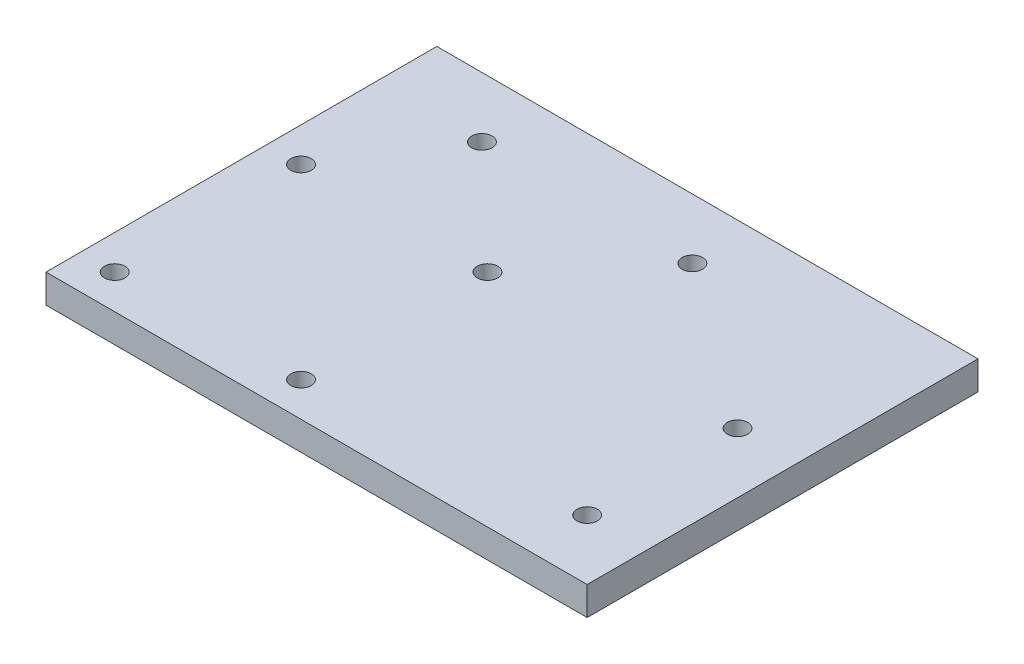
ISO-10303-21;
HEADER;
FILE_DESCRIPTION(('STEP AP214'),'2;1');
FILE_NAME('part.step','',(''),(''),'','','');
FILE_SCHEMA(('AUTOMOTIVE_DESIGN { 1 0 10303 214 1 1 1 1 }'));
ENDSEC;
DATA;
#1=APPLICATION_CONTEXT('core data for automotive mechanical design processes');
#2=APPLICATION_PROTOCOL_DEFINITION('international standard','automotive_design',2000,#1);
#3=PRODUCT_CONTEXT('',#1,'mechanical');
#4=PRODUCT('Part','Part','',(#3));
#5=PRODUCT_RELATED_PRODUCT_CATEGORY('part','',(#4));
#6=PRODUCT_DEFINITION_FORMATION('','',#4);
#7=PRODUCT_DEFINITION_CONTEXT('part definition',#1,'design');
#8=PRODUCT_DEFINITION('design','',#6,#7);
#9=PRODUCT_DEFINITION_SHAPE('','',#8);
#10=(LENGTH_UNIT() NAMED_UNIT(*) SI_UNIT(.MILLI.,.METRE.));
#11=(NAMED_UNIT(*) PLANE_ANGLE_UNIT() SI_UNIT($,.RADIAN.));
#12=(NAMED_UNIT(*) SI_UNIT($,.STERADIAN.) SOLID_ANGLE_UNIT());
#13=UNCERTAINTY_MEASURE_WITH_UNIT(LENGTH_MEASURE(1.E-05),#10,'distance_accuracy_value','');
#14=(GEOMETRIC_REPRESENTATION_CONTEXT(3) GLOBAL_UNCERTAINTY_ASSIGNED_CONTEXT((#13)) GLOBAL_UNIT_ASSIGNED_CONTEXT((#10,
#11,#12)) REPRESENTATION_CONTEXT('',''));
#15=CARTESIAN_POINT('',(0.,0.,0.));
#16=DIRECTION('',(0.,0.,1.));
#17=DIRECTION('',(1.,0.,0.));
#18=AXIS2_PLACEMENT_3D('',#15,#16,#17);
#19=CARTESIAN_POINT('',(90.,4.7625,0.));
#20=DIRECTION('',(-1.,0.,0.));
#21=DIRECTION('',(0.,0.,1.));
#22=AXIS2_PLACEMENT_3D('',#19,#20,#21);
#23=PLANE('',#22);
#24=DIRECTION('',(0.,0.,-1.));
#25=VECTOR('',#24,1.);
#26=CARTESIAN_POINT('',(90.,0.,0.));
#27=LINE('',#26,#25);
#28=CARTESIAN_POINT('',(90.,0.,0.));
#29=VERTEX_POINT('',#28);
#30=CARTESIAN_POINT('',(90.,0.,-65.));
#31=VERTEX_POINT('',#30);
#32=EDGE_CURVE('E96',#29,#31,#27,.T.);
#33=ORIENTED_EDGE('',*,*,#32,.T.);
#34=DIRECTION('',(0.,-1.,0.));
#35=VECTOR('',#34,1.);
#36=CARTESIAN_POINT('',(90.,4.7625,-65.));
#37=LINE('',#36,#35);
#38=CARTESIAN_POINT('',(90.,4.7625,-65.));
#39=VERTEX_POINT('',#38);
#40=EDGE_CURVE('E11',#39,#31,#37,.T.);
#41=ORIENTED_EDGE('',*,*,#40,.F.);
#42=DIRECTION('',(0.,0.,-1.));
#43=VECTOR('',#42,1.);
#44=CARTESIAN_POINT('',(90.,4.7625,0.));
#45=LINE('',#44,#43);
#46=CARTESIAN_POINT('',(90.,4.7625,0.));
#47=VERTEX_POINT('',#46);
#48=EDGE_CURVE('E84',#47,#39,#45,.T.);
#49=ORIENTED_EDGE('',*,*,#48,.F.);
#50=DIRECTION('',(0.,-1.,0.));
#51=VECTOR('',#50,1.);
#52=CARTESIAN_POINT('',(90.,4.7625,0.));
#53=LINE('',#52,#51);
#54=EDGE_CURVE('E92',#47,#29,#53,.T.);
#55=ORIENTED_EDGE('',*,*,#54,.T.);
#56=EDGE_LOOP('',(#33,#41,#49,#55));
#57=FACE_BOUND('',#56,.T.);
#58=ADVANCED_FACE('F33',(#57),#23,.F.);
#59=CARTESIAN_POINT('',(0.,4.7625,-65.));
#60=DIRECTION('',(0.,0.,1.));
#61=DIRECTION('',(1.,0.,0.));
#62=AXIS2_PLACEMENT_3D('',#59,#60,#61);
#63=PLANE('',#62);
#64=DIRECTION('',(-1.,0.,0.));
#65=VECTOR('',#64,1.);
#66=CARTESIAN_POINT('',(0.,0.,-65.));
#67=LINE('',#66,#65);
#68=CARTESIAN_POINT('',(0.,0.,-65.));
#69=VERTEX_POINT('',#68);
#70=EDGE_CURVE('E88',#31,#69,#67,.T.);
#71=ORIENTED_EDGE('',*,*,#70,.T.);
#72=DIRECTION('',(0.,-1.,0.));
#73=VECTOR('',#72,1.);
#74=CARTESIAN_POINT('',(0.,4.7625,-65.));
#75=LINE('',#74,#73);
#76=CARTESIAN_POINT('',(0.,4.7625,-65.));
#77=VERTEX_POINT('',#76);
#78=EDGE_CURVE('E41',#77,#69,#75,.T.);
#79=ORIENTED_EDGE('',*,*,#78,.F.);
#80=DIRECTION('',(-1.,0.,0.));
#81=VECTOR('',#80,1.);
#82=CARTESIAN_POINT('',(0.,4.7625,-65.));
#83=LINE('',#82,#81);
#84=EDGE_CURVE('E79',#39,#77,#83,.T.);
#85=ORIENTED_EDGE('',*,*,#84,.F.);
#86=ORIENTED_EDGE('',*,*,#40,.T.);
#87=EDGE_LOOP('',(#71,#79,#85,#86));
#88=FACE_BOUND('',#87,.T.);
#89=ADVANCED_FACE('F87',(#88),#63,.F.);
#90=CARTESIAN_POINT('',(0.,4.7625,0.));
#91=DIRECTION('',(1.,0.,0.));
#92=DIRECTION('',(0.,0.,-1.));
#93=AXIS2_PLACEMENT_3D('',#90,#91,#92);
#94=PLANE('',#93);
#95=DIRECTION('',(0.,0.,1.));
#96=VECTOR('',#95,1.);
#97=CARTESIAN_POINT('',(0.,0.,0.));
#98=LINE('',#97,#96);
#99=CARTESIAN_POINT('',(0.,0.,0.));
#100=VERTEX_POINT('',#99);
#101=EDGE_CURVE('E66',#69,#100,#98,.T.);
#102=ORIENTED_EDGE('',*,*,#101,.T.);
#103=DIRECTION('',(0.,-1.,0.));
#104=VECTOR('',#103,1.);
#105=CARTESIAN_POINT('',(0.,4.7625,0.));
#106=LINE('',#105,#104);
#107=CARTESIAN_POINT('',(0.,4.7625,0.));
#108=VERTEX_POINT('',#107);
#109=EDGE_CURVE('E89',#108,#100,#106,.T.);
#110=ORIENTED_EDGE('',*,*,#109,.F.);
#111=DIRECTION('',(0.,0.,1.));
#112=VECTOR('',#111,1.);
#113=CARTESIAN_POINT('',(0.,4.7625,0.));
#114=LINE('',#113,#112);
#115=EDGE_CURVE('E82',#77,#108,#114,.T.);
#116=ORIENTED_EDGE('',*,*,#115,.F.);
#117=ORIENTED_EDGE('',*,*,#78,.T.);
#118=EDGE_LOOP('',(#102,#110,#116,#117));
#119=FACE_BOUND('',#118,.T.);
#120=ADVANCED_FACE('F90',(#119),#94,.F.);
#121=CARTESIAN_POINT('',(0.,4.7625,0.));
#122=DIRECTION('',(0.,0.,-1.));
#123=DIRECTION('',(-1.,0.,0.));
#124=AXIS2_PLACEMENT_3D('',#121,#122,#123);
#125=PLANE('',#124);
#126=DIRECTION('',(1.,0.,0.));
#127=VECTOR('',#126,1.);
#128=CARTESIAN_POINT('',(0.,0.,0.));
#129=LINE('',#128,#127);
#130=EDGE_CURVE('E72',#100,#29,#129,.T.);
#131=ORIENTED_EDGE('',*,*,#130,.T.);
#132=ORIENTED_EDGE('',*,*,#54,.F.);
#133=DIRECTION('',(1.,0.,0.));
#134=VECTOR('',#133,1.);
#135=CARTESIAN_POINT('',(0.,4.7625,0.));
#136=LINE('',#135,#134);
#137=EDGE_CURVE('E49',#108,#47,#136,.T.);
#138=ORIENTED_EDGE('',*,*,#137,.F.);
#139=ORIENTED_EDGE('',*,*,#109,.T.);
#140=EDGE_LOOP('',(#131,#132,#138,#139));
#141=FACE_BOUND('',#140,.T.);
#142=ADVANCED_FACE('F104',(#141),#125,.F.);
#143=CARTESIAN_POINT('',(0.,4.7625,0.));
#144=DIRECTION('',(0.,-1.,0.));
#145=DIRECTION('',(0.,0.,-1.));
#146=AXIS2_PLACEMENT_3D('',#143,#144,#145);
#147=PLANE('',#146);
#148=CARTESIAN_POINT('',(17.5,4.7625,-55.));
#149=DIRECTION('',(0.,-1.,0.));
#150=DIRECTION('',(0.,0.,-1.));
#151=AXIS2_PLACEMENT_3D('',#148,#149,#150);
#152=CIRCLE('',#151,1.7);
#153=CARTESIAN_POINT('',(17.5,4.7625,-56.7));
#154=VERTEX_POINT('',#153);
#155=EDGE_CURVE('E151',#154,#154,#152,.T.);
#156=ORIENTED_EDGE('',*,*,#155,.T.);
#157=EDGE_LOOP('',(#156));
#158=FACE_BOUND('',#157,.T.);
#159=CARTESIAN_POINT('',(52.5,4.7625,-55.));
#160=DIRECTION('',(0.,-1.,0.));
#161=DIRECTION('',(0.,0.,-1.));
#162=AXIS2_PLACEMENT_3D('',#159,#160,#161);
#163=CIRCLE('',#162,1.7);
#164=CARTESIAN_POINT('',(52.5,4.7625,-56.7));
#165=VERTEX_POINT('',#164);
#166=EDGE_CURVE('E145',#165,#165,#163,.T.);
#167=ORIENTED_EDGE('',*,*,#166,.T.);
#168=EDGE_LOOP('',(#167));
#169=FACE_BOUND('',#168,.T.);
#170=CARTESIAN_POINT('',(80.,4.7625,-35.));
#171=DIRECTION('',(0.,-1.,0.));
#172=DIRECTION('',(0.,0.,-1.));
#173=AXIS2_PLACEMENT_3D('',#170,#171,#172);
#174=CIRCLE('',#173,1.69999999999999);
#175=CARTESIAN_POINT('',(80.,4.7625,-36.7));
#176=VERTEX_POINT('',#175);
#177=EDGE_CURVE('E139',#176,#176,#174,.T.);
#178=ORIENTED_EDGE('',*,*,#177,.T.);
#179=EDGE_LOOP('',(#178));
#180=FACE_BOUND('',#179,.T.);
#181=CARTESIAN_POINT('',(80.,4.7625,-9.99999999999999));
#182=DIRECTION('',(0.,-1.,0.));
#183=DIRECTION('',(0.,0.,-1.));
#184=AXIS2_PLACEMENT_3D('',#181,#182,#183);
#185=CIRCLE('',#184,1.69999999999999);
#186=CARTESIAN_POINT('',(80.,4.7625,-11.7));
#187=VERTEX_POINT('',#186);
#188=EDGE_CURVE('E133',#187,#187,#185,.T.);
#189=ORIENTED_EDGE('',*,*,#188,.T.);
#190=EDGE_LOOP('',(#189));
#191=FACE_BOUND('',#190,.T.);
#192=CARTESIAN_POINT('',(36.7090000000001,4.7625,-5.70900000000009));
#193=DIRECTION('',(0.,1.,0.));
#194=DIRECTION('',(0.,0.,1.));
#195=AXIS2_PLACEMENT_3D('',#192,#193,#194);
#196=CIRCLE('',#195,1.7);
#197=CARTESIAN_POINT('',(36.7090000000001,4.7625,-4.00900000000009));
#198=VERTEX_POINT('',#197);
#199=EDGE_CURVE('E130',#198,#198,#196,.T.);
#200=ORIENTED_EDGE('',*,*,#199,.F.);
#201=EDGE_LOOP('',(#200));
#202=FACE_BOUND('',#201,.T.);
#203=CARTESIAN_POINT('',(36.7090000000001,4.7625,-36.7090000000001));
#204=DIRECTION('',(0.,1.,0.));
#205=DIRECTION('',(0.,0.,1.));
#206=AXIS2_PLACEMENT_3D('',#203,#204,#205);
#207=CIRCLE('',#206,1.7);
#208=CARTESIAN_POINT('',(36.7090000000001,4.7625,-35.0090000000001));
#209=VERTEX_POINT('',#208);
#210=EDGE_CURVE('E124',#209,#209,#207,.T.);
#211=ORIENTED_EDGE('',*,*,#210,.F.);
#212=EDGE_LOOP('',(#211));
#213=FACE_BOUND('',#212,.T.);
#214=CARTESIAN_POINT('',(5.70900000000006,4.7625,-36.7090000000001));
#215=DIRECTION('',(0.,1.,0.));
#216=DIRECTION('',(0.,0.,1.));
#217=AXIS2_PLACEMENT_3D('',#214,#215,#216);
#218=CIRCLE('',#217,1.7);
#219=CARTESIAN_POINT('',(5.70900000000006,4.7625,-35.0090000000001));
#220=VERTEX_POINT('',#219);
#221=EDGE_CURVE('E118',#220,#220,#218,.T.);
#222=ORIENTED_EDGE('',*,*,#221,.F.);
#223=EDGE_LOOP('',(#222));
#224=FACE_BOUND('',#223,.T.);
#225=CARTESIAN_POINT('',(5.70900000000006,4.7625,-5.70900000000009));
#226=DIRECTION('',(0.,1.,0.));
#227=DIRECTION('',(0.,0.,1.));
#228=AXIS2_PLACEMENT_3D('',#225,#226,#227);
#229=CIRCLE('',#228,1.7);
#230=CARTESIAN_POINT('',(5.70900000000006,4.7625,-4.00900000000009));
#231=VERTEX_POINT('',#230);
#232=EDGE_CURVE('E112',#231,#231,#229,.T.);
#233=ORIENTED_EDGE('',*,*,#232,.F.);
#234=EDGE_LOOP('',(#233));
#235=FACE_BOUND('',#234,.T.);
#236=ORIENTED_EDGE('',*,*,#48,.T.);
#237=ORIENTED_EDGE('',*,*,#84,.T.);
#238=ORIENTED_EDGE('',*,*,#115,.T.);
#239=ORIENTED_EDGE('',*,*,#137,.T.);
#240=EDGE_LOOP('',(#236,#237,#238,#239));
#241=FACE_BOUND('',#240,.T.);
#242=ADVANCED_FACE('F80',(#158,#169,#180,#191,#202,#213,#224,#235,#241),#147,.F.);
#243=CARTESIAN_POINT('',(0.,0.,0.));
#244=DIRECTION('',(0.,-1.,0.));
#245=DIRECTION('',(0.,0.,-1.));
#246=AXIS2_PLACEMENT_3D('',#243,#244,#245);
#247=PLANE('',#246);
#248=CARTESIAN_POINT('',(17.5,0.,-55.));
#249=DIRECTION('',(0.,-1.,0.));
#250=DIRECTION('',(0.,0.,-1.));
#251=AXIS2_PLACEMENT_3D('',#248,#249,#250);
#252=CIRCLE('',#251,1.69999999999999);
#253=CARTESIAN_POINT('',(17.5,0.,-56.7));
#254=VERTEX_POINT('',#253);
#255=EDGE_CURVE('E154',#254,#254,#252,.T.);
#256=ORIENTED_EDGE('',*,*,#255,.F.);
#257=EDGE_LOOP('',(#256));
#258=FACE_BOUND('',#257,.T.);
#259=CARTESIAN_POINT('',(52.5,0.,-55.));
#260=DIRECTION('',(0.,-1.,0.));
#261=DIRECTION('',(0.,0.,-1.));
#262=AXIS2_PLACEMENT_3D('',#259,#260,#261);
#263=CIRCLE('',#262,1.69999999999999);
#264=CARTESIAN_POINT('',(52.5,0.,-56.7));
#265=VERTEX_POINT('',#264);
#266=EDGE_CURVE('E148',#265,#265,#263,.T.);
#267=ORIENTED_EDGE('',*,*,#266,.F.);
#268=EDGE_LOOP('',(#267));
#269=FACE_BOUND('',#268,.T.);
#270=CARTESIAN_POINT('',(80.,0.,-35.));
#271=DIRECTION('',(0.,-1.,0.));
#272=DIRECTION('',(0.,0.,-1.));
#273=AXIS2_PLACEMENT_3D('',#270,#271,#272);
#274=CIRCLE('',#273,1.69999999999999);
#275=CARTESIAN_POINT('',(80.,0.,-36.7));
#276=VERTEX_POINT('',#275);
#277=EDGE_CURVE('E142',#276,#276,#274,.T.);
#278=ORIENTED_EDGE('',*,*,#277,.F.);
#279=EDGE_LOOP('',(#278));
#280=FACE_BOUND('',#279,.T.);
#281=CARTESIAN_POINT('',(80.,0.,-9.99999999999999));
#282=DIRECTION('',(0.,-1.,0.));
#283=DIRECTION('',(0.,0.,-1.));
#284=AXIS2_PLACEMENT_3D('',#281,#282,#283);
#285=CIRCLE('',#284,1.69999999999999);
#286=CARTESIAN_POINT('',(80.,0.,-11.7));
#287=VERTEX_POINT('',#286);
#288=EDGE_CURVE('E136',#287,#287,#285,.T.);
#289=ORIENTED_EDGE('',*,*,#288,.F.);
#290=EDGE_LOOP('',(#289));
#291=FACE_BOUND('',#290,.T.);
#292=CARTESIAN_POINT('',(36.7090000000001,0.,-5.70900000000009));
#293=DIRECTION('',(0.,1.,0.));
#294=DIRECTION('',(0.,0.,1.));
#295=AXIS2_PLACEMENT_3D('',#292,#293,#294);
#296=CIRCLE('',#295,1.7);
#297=CARTESIAN_POINT('',(36.7090000000001,0.,-4.00900000000009));
#298=VERTEX_POINT('',#297);
#299=EDGE_CURVE('E127',#298,#298,#296,.T.);
#300=ORIENTED_EDGE('',*,*,#299,.T.);
#301=EDGE_LOOP('',(#300));
#302=FACE_BOUND('',#301,.T.);
#303=CARTESIAN_POINT('',(36.7090000000001,0.,-36.7090000000001));
#304=DIRECTION('',(0.,1.,0.));
#305=DIRECTION('',(0.,0.,1.));
#306=AXIS2_PLACEMENT_3D('',#303,#304,#305);
#307=CIRCLE('',#306,1.7);
#308=CARTESIAN_POINT('',(36.7090000000001,0.,-35.0090000000001));
#309=VERTEX_POINT('',#308);
#310=EDGE_CURVE('E121',#309,#309,#307,.T.);
#311=ORIENTED_EDGE('',*,*,#310,.T.);
#312=EDGE_LOOP('',(#311));
#313=FACE_BOUND('',#312,.T.);
#314=CARTESIAN_POINT('',(5.70900000000006,0.,-36.7090000000001));
#315=DIRECTION('',(0.,1.,0.));
#316=DIRECTION('',(0.,0.,1.));
#317=AXIS2_PLACEMENT_3D('',#314,#315,#316);
#318=CIRCLE('',#317,1.7);
#319=CARTESIAN_POINT('',(5.70900000000006,0.,-35.0090000000001));
#320=VERTEX_POINT('',#319);
#321=EDGE_CURVE('E115',#320,#320,#318,.T.);
#322=ORIENTED_EDGE('',*,*,#321,.T.);
#323=EDGE_LOOP('',(#322));
#324=FACE_BOUND('',#323,.T.);
#325=CARTESIAN_POINT('',(5.70900000000006,0.,-5.70900000000009));
#326=DIRECTION('',(0.,1.,0.));
#327=DIRECTION('',(0.,0.,1.));
#328=AXIS2_PLACEMENT_3D('',#325,#326,#327);
#329=CIRCLE('',#328,1.7);
#330=CARTESIAN_POINT('',(5.70900000000006,0.,-4.00900000000009));
#331=VERTEX_POINT('',#330);
#332=EDGE_CURVE('E99',#331,#331,#329,.T.);
#333=ORIENTED_EDGE('',*,*,#332,.T.);
#334=EDGE_LOOP('',(#333));
#335=FACE_BOUND('',#334,.T.);
#336=ORIENTED_EDGE('',*,*,#32,.F.);
#337=ORIENTED_EDGE('',*,*,#130,.F.);
#338=ORIENTED_EDGE('',*,*,#101,.F.);
#339=ORIENTED_EDGE('',*,*,#70,.F.);
#340=EDGE_LOOP('',(#336,#337,#338,#339));
#341=FACE_BOUND('',#340,.T.);
#342=ADVANCED_FACE('F107',(#258,#269,#280,#291,#302,#313,#324,#335,#341),#247,.T.);
#343=CARTESIAN_POINT('',(5.70900000000006,4.7625,-5.70900000000009));
#344=DIRECTION('',(0.,1.,0.));
#345=DIRECTION('',(0.,0.,1.));
#346=AXIS2_PLACEMENT_3D('',#343,#344,#345);
#347=CYLINDRICAL_SURFACE('',#346,1.7);
#348=ORIENTED_EDGE('',*,*,#332,.F.);
#349=EDGE_LOOP('',(#348));
#350=FACE_BOUND('',#349,.T.);
#351=ORIENTED_EDGE('',*,*,#232,.T.);
#352=EDGE_LOOP('',(#351));
#353=FACE_BOUND('',#352,.T.);
#354=ADVANCED_FACE('F162',(#350,#353),#347,.F.);
#355=CARTESIAN_POINT('',(5.70900000000006,4.7625,-36.7090000000001));
#356=DIRECTION('',(0.,1.,0.));
#357=DIRECTION('',(0.,0.,1.));
#358=AXIS2_PLACEMENT_3D('',#355,#356,#357);
#359=CYLINDRICAL_SURFACE('',#358,1.7);
#360=ORIENTED_EDGE('',*,*,#321,.F.);
#361=EDGE_LOOP('',(#360));
#362=FACE_BOUND('',#361,.T.);
#363=ORIENTED_EDGE('',*,*,#221,.T.);
#364=EDGE_LOOP('',(#363));
#365=FACE_BOUND('',#364,.T.);
#366=ADVANCED_FACE('F180',(#362,#365),#359,.F.);
#367=CARTESIAN_POINT('',(36.7090000000001,4.7625,-36.7090000000001));
#368=DIRECTION('',(0.,1.,0.));
#369=DIRECTION('',(0.,0.,1.));
#370=AXIS2_PLACEMENT_3D('',#367,#368,#369);
#371=CYLINDRICAL_SURFACE('',#370,1.7);
#372=ORIENTED_EDGE('',*,*,#310,.F.);
#373=EDGE_LOOP('',(#372));
#374=FACE_BOUND('',#373,.T.);
#375=ORIENTED_EDGE('',*,*,#210,.T.);
#376=EDGE_LOOP('',(#375));
#377=FACE_BOUND('',#376,.T.);
#378=ADVANCED_FACE('F223',(#374,#377),#371,.F.);
#379=CARTESIAN_POINT('',(36.7090000000001,4.7625,-5.70900000000009));
#380=DIRECTION('',(0.,1.,0.));
#381=DIRECTION('',(0.,0.,1.));
#382=AXIS2_PLACEMENT_3D('',#379,#380,#381);
#383=CYLINDRICAL_SURFACE('',#382,1.7);
#384=ORIENTED_EDGE('',*,*,#299,.F.);
#385=EDGE_LOOP('',(#384));
#386=FACE_BOUND('',#385,.T.);
#387=ORIENTED_EDGE('',*,*,#199,.T.);
#388=EDGE_LOOP('',(#387));
#389=FACE_BOUND('',#388,.T.);
#390=ADVANCED_FACE('F233',(#386,#389),#383,.F.);
#391=CARTESIAN_POINT('',(80.,0.,-9.99999999999999));
#392=DIRECTION('',(0.,-1.,0.));
#393=DIRECTION('',(0.,0.,-1.));
#394=AXIS2_PLACEMENT_3D('',#391,#392,#393);
#395=CYLINDRICAL_SURFACE('',#394,1.69999999999999);
#396=ORIENTED_EDGE('',*,*,#188,.F.);
#397=EDGE_LOOP('',(#396));
#398=FACE_BOUND('',#397,.T.);
#399=ORIENTED_EDGE('',*,*,#288,.T.);
#400=EDGE_LOOP('',(#399));
#401=FACE_BOUND('',#400,.T.);
#402=ADVANCED_FACE('F242',(#398,#401),#395,.F.);
#403=CARTESIAN_POINT('',(80.,0.,-35.));
#404=DIRECTION('',(0.,-1.,0.));
#405=DIRECTION('',(0.,0.,-1.));
#406=AXIS2_PLACEMENT_3D('',#403,#404,#405);
#407=CYLINDRICAL_SURFACE('',#406,1.69999999999999);
#408=ORIENTED_EDGE('',*,*,#177,.F.);
#409=EDGE_LOOP('',(#408));
#410=FACE_BOUND('',#409,.T.);
#411=ORIENTED_EDGE('',*,*,#277,.T.);
#412=EDGE_LOOP('',(#411));
#413=FACE_BOUND('',#412,.T.);
#414=ADVANCED_FACE('F261',(#410,#413),#407,.F.);
#415=CARTESIAN_POINT('',(52.5,0.,-55.));
#416=DIRECTION('',(0.,-1.,0.));
#417=DIRECTION('',(0.,0.,-1.));
#418=AXIS2_PLACEMENT_3D('',#415,#416,#417);
#419=CYLINDRICAL_SURFACE('',#418,1.69999999999999);
#420=ORIENTED_EDGE('',*,*,#166,.F.);
#421=EDGE_LOOP('',(#420));
#422=FACE_BOUND('',#421,.T.);
#423=ORIENTED_EDGE('',*,*,#266,.T.);
#424=EDGE_LOOP('',(#423));
#425=FACE_BOUND('',#424,.T.);
#426=ADVANCED_FACE('F271',(#422,#425),#419,.F.);
#427=CARTESIAN_POINT('',(17.5,0.,-55.));
#428=DIRECTION('',(0.,-1.,0.));
#429=DIRECTION('',(0.,0.,-1.));
#430=AXIS2_PLACEMENT_3D('',#427,#428,#429);
#431=CYLINDRICAL_SURFACE('',#430,1.69999999999999);
#432=ORIENTED_EDGE('',*,*,#155,.F.);
#433=EDGE_LOOP('',(#432));
#434=FACE_BOUND('',#433,.T.);
#435=ORIENTED_EDGE('',*,*,#255,.T.);
#436=EDGE_LOOP('',(#435));
#437=FACE_BOUND('',#436,.T.);
#438=ADVANCED_FACE('F158',(#434,#437),#431,.F.);
#439=CLOSED_SHELL('',(#58,#89,#120,#142,#242,#342,#354,#366,#378,#390,#402,#414,#426,#438));
#440=MANIFOLD_SOLID_BREP('B2',#439);
#441=ADVANCED_BREP_SHAPE_REPRESENTATION('',(#18,#440),#14);
#442=SHAPE_DEFINITION_REPRESENTATION(#9,#441);
ENDSEC;
END-ISO-10303-21;
